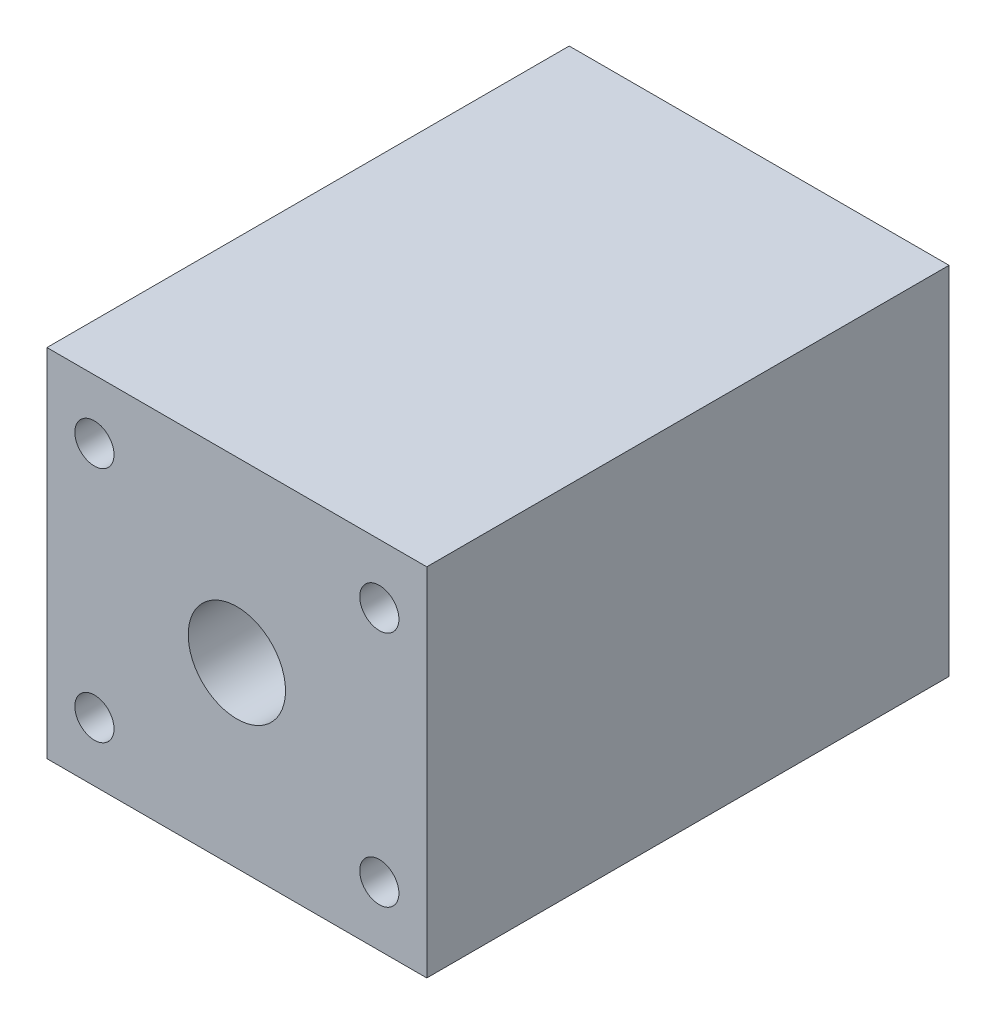
ISO-10303-21;
HEADER;
FILE_DESCRIPTION(('STEP AP214'),'2;1');
FILE_NAME('part.step','',(''),(''),'','','');
FILE_SCHEMA(('AUTOMOTIVE_DESIGN { 1 0 10303 214 1 1 1 1 }'));
ENDSEC;
DATA;
#1=APPLICATION_CONTEXT('core data for automotive mechanical design processes');
#2=APPLICATION_PROTOCOL_DEFINITION('international standard','automotive_design',2000,#1);
#3=PRODUCT_CONTEXT('',#1,'mechanical');
#4=PRODUCT('Part','Part','',(#3));
#5=PRODUCT_RELATED_PRODUCT_CATEGORY('part','',(#4));
#6=PRODUCT_DEFINITION_FORMATION('','',#4);
#7=PRODUCT_DEFINITION_CONTEXT('part definition',#1,'design');
#8=PRODUCT_DEFINITION('design','',#6,#7);
#9=PRODUCT_DEFINITION_SHAPE('','',#8);
#10=(LENGTH_UNIT() NAMED_UNIT(*) SI_UNIT(.MILLI.,.METRE.));
#11=(NAMED_UNIT(*) PLANE_ANGLE_UNIT() SI_UNIT($,.RADIAN.));
#12=(NAMED_UNIT(*) SI_UNIT($,.STERADIAN.) SOLID_ANGLE_UNIT());
#13=UNCERTAINTY_MEASURE_WITH_UNIT(LENGTH_MEASURE(1.E-05),#10,'distance_accuracy_value','');
#14=(GEOMETRIC_REPRESENTATION_CONTEXT(3) GLOBAL_UNCERTAINTY_ASSIGNED_CONTEXT((#13)) GLOBAL_UNIT_ASSIGNED_CONTEXT((#10,
#11,#12)) REPRESENTATION_CONTEXT('',''));
#15=CARTESIAN_POINT('',(0.,0.,0.));
#16=DIRECTION('',(0.,0.,1.));
#17=DIRECTION('',(1.,0.,0.));
#18=AXIS2_PLACEMENT_3D('',#15,#16,#17);
#19=CARTESIAN_POINT('',(12.,10.,36.));
#20=DIRECTION('',(0.,0.,1.));
#21=DIRECTION('',(1.,0.,0.));
#22=AXIS2_PLACEMENT_3D('',#19,#20,#21);
#23=PLANE('',#22);
#24=CARTESIAN_POINT('',(12.,10.,36.));
#25=DIRECTION('',(0.,0.,1.));
#26=DIRECTION('',(1.,0.,0.));
#27=AXIS2_PLACEMENT_3D('',#24,#25,#26);
#28=CIRCLE('',#27,1.65);
#29=CARTESIAN_POINT('',(13.65,10.,36.));
#30=VERTEX_POINT('',#29);
#31=EDGE_CURVE('E10',#30,#30,#28,.T.);
#32=ORIENTED_EDGE('',*,*,#31,.T.);
#33=EDGE_LOOP('',(#32));
#34=FACE_BOUND('',#33,.T.);
#35=ADVANCED_FACE('F16',(#34),#23,.T.);
#36=CARTESIAN_POINT('',(-12.,10.,36.));
#37=DIRECTION('',(0.,0.,1.));
#38=DIRECTION('',(1.,0.,0.));
#39=AXIS2_PLACEMENT_3D('',#36,#37,#38);
#40=PLANE('',#39);
#41=CARTESIAN_POINT('',(-12.,10.,36.));
#42=DIRECTION('',(0.,0.,1.));
#43=DIRECTION('',(1.,0.,0.));
#44=AXIS2_PLACEMENT_3D('',#41,#42,#43);
#45=CIRCLE('',#44,1.65);
#46=CARTESIAN_POINT('',(-10.35,10.,36.));
#47=VERTEX_POINT('',#46);
#48=EDGE_CURVE('E26',#47,#47,#45,.T.);
#49=ORIENTED_EDGE('',*,*,#48,.T.);
#50=EDGE_LOOP('',(#49));
#51=FACE_BOUND('',#50,.T.);
#52=ADVANCED_FACE('F18',(#51),#40,.T.);
#53=CARTESIAN_POINT('',(12.,-10.,36.));
#54=DIRECTION('',(0.,0.,1.));
#55=DIRECTION('',(1.,0.,0.));
#56=AXIS2_PLACEMENT_3D('',#53,#54,#55);
#57=PLANE('',#56);
#58=CARTESIAN_POINT('',(12.,-10.,36.));
#59=DIRECTION('',(0.,0.,1.));
#60=DIRECTION('',(1.,0.,0.));
#61=AXIS2_PLACEMENT_3D('',#58,#59,#60);
#62=CIRCLE('',#61,1.65);
#63=CARTESIAN_POINT('',(13.65,-10.,36.));
#64=VERTEX_POINT('',#63);
#65=EDGE_CURVE('E121',#64,#64,#62,.T.);
#66=ORIENTED_EDGE('',*,*,#65,.T.);
#67=EDGE_LOOP('',(#66));
#68=FACE_BOUND('',#67,.T.);
#69=ADVANCED_FACE('F155',(#68),#57,.T.);
#70=CARTESIAN_POINT('',(-12.,-10.,36.));
#71=DIRECTION('',(0.,0.,1.));
#72=DIRECTION('',(1.,0.,0.));
#73=AXIS2_PLACEMENT_3D('',#70,#71,#72);
#74=PLANE('',#73);
#75=CARTESIAN_POINT('',(-12.,-10.,36.));
#76=DIRECTION('',(0.,0.,1.));
#77=DIRECTION('',(1.,0.,0.));
#78=AXIS2_PLACEMENT_3D('',#75,#76,#77);
#79=CIRCLE('',#78,1.65);
#80=CARTESIAN_POINT('',(-10.35,-10.,36.));
#81=VERTEX_POINT('',#80);
#82=EDGE_CURVE('E117',#81,#81,#79,.T.);
#83=ORIENTED_EDGE('',*,*,#82,.T.);
#84=EDGE_LOOP('',(#83));
#85=FACE_BOUND('',#84,.T.);
#86=ADVANCED_FACE('F176',(#85),#74,.T.);
#87=CARTESIAN_POINT('',(12.,10.,36.));
#88=DIRECTION('',(0.,0.,1.));
#89=DIRECTION('',(1.,0.,0.));
#90=AXIS2_PLACEMENT_3D('',#87,#88,#89);
#91=CYLINDRICAL_SURFACE('',#90,1.65);
#92=CARTESIAN_POINT('',(12.,10.,44.));
#93=DIRECTION('',(0.,0.,1.));
#94=DIRECTION('',(1.,0.,0.));
#95=AXIS2_PLACEMENT_3D('',#92,#93,#94);
#96=CIRCLE('',#95,1.65);
#97=CARTESIAN_POINT('',(13.65,10.,44.));
#98=VERTEX_POINT('',#97);
#99=EDGE_CURVE('E104',#98,#98,#96,.T.);
#100=ORIENTED_EDGE('',*,*,#99,.T.);
#101=EDGE_LOOP('',(#100));
#102=FACE_BOUND('',#101,.T.);
#103=ORIENTED_EDGE('',*,*,#31,.F.);
#104=EDGE_LOOP('',(#103));
#105=FACE_BOUND('',#104,.T.);
#106=ADVANCED_FACE('F144',(#102,#105),#91,.F.);
#107=CARTESIAN_POINT('',(0.,0.,-1.));
#108=DIRECTION('',(0.,0.,1.));
#109=DIRECTION('',(1.,0.,0.));
#110=AXIS2_PLACEMENT_3D('',#107,#108,#109);
#111=CYLINDRICAL_SURFACE('',#110,4.1);
#112=CARTESIAN_POINT('',(0.,0.,44.));
#113=DIRECTION('',(0.,0.,1.));
#114=DIRECTION('',(1.,0.,0.));
#115=AXIS2_PLACEMENT_3D('',#112,#113,#114);
#116=CIRCLE('',#115,4.1);
#117=CARTESIAN_POINT('',(4.1,0.,44.));
#118=VERTEX_POINT('',#117);
#119=EDGE_CURVE('E100',#118,#118,#116,.T.);
#120=ORIENTED_EDGE('',*,*,#119,.T.);
#121=EDGE_LOOP('',(#120));
#122=FACE_BOUND('',#121,.T.);
#123=CARTESIAN_POINT('',(0.,0.,0.));
#124=DIRECTION('',(0.,0.,1.));
#125=DIRECTION('',(1.,0.,0.));
#126=AXIS2_PLACEMENT_3D('',#123,#124,#125);
#127=CIRCLE('',#126,4.1);
#128=CARTESIAN_POINT('',(4.1,0.,0.));
#129=VERTEX_POINT('',#128);
#130=EDGE_CURVE('E113',#129,#129,#127,.T.);
#131=ORIENTED_EDGE('',*,*,#130,.F.);
#132=EDGE_LOOP('',(#131));
#133=FACE_BOUND('',#132,.T.);
#134=ADVANCED_FACE('F133',(#122,#133),#111,.F.);
#135=CARTESIAN_POINT('',(-12.,10.,36.));
#136=DIRECTION('',(0.,0.,1.));
#137=DIRECTION('',(1.,0.,0.));
#138=AXIS2_PLACEMENT_3D('',#135,#136,#137);
#139=CYLINDRICAL_SURFACE('',#138,1.65);
#140=CARTESIAN_POINT('',(-12.,10.,44.));
#141=DIRECTION('',(0.,0.,1.));
#142=DIRECTION('',(1.,0.,0.));
#143=AXIS2_PLACEMENT_3D('',#140,#141,#142);
#144=CIRCLE('',#143,1.65);
#145=CARTESIAN_POINT('',(-10.35,10.,44.));
#146=VERTEX_POINT('',#145);
#147=EDGE_CURVE('E93',#146,#146,#144,.T.);
#148=ORIENTED_EDGE('',*,*,#147,.T.);
#149=EDGE_LOOP('',(#148));
#150=FACE_BOUND('',#149,.T.);
#151=ORIENTED_EDGE('',*,*,#48,.F.);
#152=EDGE_LOOP('',(#151));
#153=FACE_BOUND('',#152,.T.);
#154=ADVANCED_FACE('F130',(#150,#153),#139,.F.);
#155=CARTESIAN_POINT('',(12.,-10.,36.));
#156=DIRECTION('',(0.,0.,1.));
#157=DIRECTION('',(1.,0.,0.));
#158=AXIS2_PLACEMENT_3D('',#155,#156,#157);
#159=CYLINDRICAL_SURFACE('',#158,1.65);
#160=CARTESIAN_POINT('',(12.,-10.,44.));
#161=DIRECTION('',(0.,0.,1.));
#162=DIRECTION('',(1.,0.,0.));
#163=AXIS2_PLACEMENT_3D('',#160,#161,#162);
#164=CIRCLE('',#163,1.65);
#165=CARTESIAN_POINT('',(13.65,-10.,44.));
#166=VERTEX_POINT('',#165);
#167=EDGE_CURVE('E89',#166,#166,#164,.T.);
#168=ORIENTED_EDGE('',*,*,#167,.T.);
#169=EDGE_LOOP('',(#168));
#170=FACE_BOUND('',#169,.T.);
#171=ORIENTED_EDGE('',*,*,#65,.F.);
#172=EDGE_LOOP('',(#171));
#173=FACE_BOUND('',#172,.T.);
#174=ADVANCED_FACE('F132',(#170,#173),#159,.F.);
#175=CARTESIAN_POINT('',(-12.,-10.,36.));
#176=DIRECTION('',(0.,0.,1.));
#177=DIRECTION('',(1.,0.,0.));
#178=AXIS2_PLACEMENT_3D('',#175,#176,#177);
#179=CYLINDRICAL_SURFACE('',#178,1.65);
#180=CARTESIAN_POINT('',(-12.,-10.,44.));
#181=DIRECTION('',(0.,0.,1.));
#182=DIRECTION('',(1.,0.,0.));
#183=AXIS2_PLACEMENT_3D('',#180,#181,#182);
#184=CIRCLE('',#183,1.65);
#185=CARTESIAN_POINT('',(-10.35,-10.,44.));
#186=VERTEX_POINT('',#185);
#187=EDGE_CURVE('E94',#186,#186,#184,.T.);
#188=ORIENTED_EDGE('',*,*,#187,.T.);
#189=EDGE_LOOP('',(#188));
#190=FACE_BOUND('',#189,.T.);
#191=ORIENTED_EDGE('',*,*,#82,.F.);
#192=EDGE_LOOP('',(#191));
#193=FACE_BOUND('',#192,.T.);
#194=ADVANCED_FACE('F141',(#190,#193),#179,.F.);
#195=CARTESIAN_POINT('',(16.,-15.,0.));
#196=DIRECTION('',(1.,0.,0.));
#197=DIRECTION('',(0.,1.,0.));
#198=AXIS2_PLACEMENT_3D('',#195,#196,#197);
#199=PLANE('',#198);
#200=DIRECTION('',(0.,0.,1.));
#201=VECTOR('',#200,1.);
#202=CARTESIAN_POINT('',(16.,-15.,0.));
#203=LINE('',#202,#201);
#204=CARTESIAN_POINT('',(16.,-15.,0.));
#205=VERTEX_POINT('',#204);
#206=CARTESIAN_POINT('',(16.,-15.,44.));
#207=VERTEX_POINT('',#206);
#208=EDGE_CURVE('E55',#205,#207,#203,.T.);
#209=ORIENTED_EDGE('',*,*,#208,.F.);
#210=DIRECTION('',(0.,1.,0.));
#211=VECTOR('',#210,1.);
#212=CARTESIAN_POINT('',(16.,-15.,0.));
#213=LINE('',#212,#211);
#214=CARTESIAN_POINT('',(16.,15.,0.));
#215=VERTEX_POINT('',#214);
#216=EDGE_CURVE('E38',#205,#215,#213,.T.);
#217=ORIENTED_EDGE('',*,*,#216,.T.);
#218=DIRECTION('',(0.,0.,1.));
#219=VECTOR('',#218,1.);
#220=CARTESIAN_POINT('',(16.,15.,0.));
#221=LINE('',#220,#219);
#222=CARTESIAN_POINT('',(16.,15.,44.));
#223=VERTEX_POINT('',#222);
#224=EDGE_CURVE('E56',#215,#223,#221,.T.);
#225=ORIENTED_EDGE('',*,*,#224,.T.);
#226=DIRECTION('',(0.,1.,0.));
#227=VECTOR('',#226,1.);
#228=CARTESIAN_POINT('',(16.,-15.,44.));
#229=LINE('',#228,#227);
#230=EDGE_CURVE('E51',#207,#223,#229,.T.);
#231=ORIENTED_EDGE('',*,*,#230,.F.);
#232=EDGE_LOOP('',(#209,#217,#225,#231));
#233=FACE_BOUND('',#232,.T.);
#234=ADVANCED_FACE('F53',(#233),#199,.T.);
#235=CARTESIAN_POINT('',(-16.,-15.,0.));
#236=DIRECTION('',(0.,0.,1.));
#237=DIRECTION('',(1.,0.,0.));
#238=AXIS2_PLACEMENT_3D('',#235,#236,#237);
#239=PLANE('',#238);
#240=ORIENTED_EDGE('',*,*,#130,.T.);
#241=EDGE_LOOP('',(#240));
#242=FACE_BOUND('',#241,.T.);
#243=DIRECTION('',(1.,0.,0.));
#244=VECTOR('',#243,1.);
#245=CARTESIAN_POINT('',(-16.,15.,0.));
#246=LINE('',#245,#244);
#247=CARTESIAN_POINT('',(-16.,15.,0.));
#248=VERTEX_POINT('',#247);
#249=EDGE_CURVE('E108',#248,#215,#246,.T.);
#250=ORIENTED_EDGE('',*,*,#249,.T.);
#251=ORIENTED_EDGE('',*,*,#216,.F.);
#252=DIRECTION('',(1.,0.,0.));
#253=VECTOR('',#252,1.);
#254=CARTESIAN_POINT('',(-16.,-15.,0.));
#255=LINE('',#254,#253);
#256=CARTESIAN_POINT('',(-16.,-15.,0.));
#257=VERTEX_POINT('',#256);
#258=EDGE_CURVE('E62',#257,#205,#255,.T.);
#259=ORIENTED_EDGE('',*,*,#258,.F.);
#260=DIRECTION('',(0.,1.,0.));
#261=VECTOR('',#260,1.);
#262=CARTESIAN_POINT('',(-16.,-15.,0.));
#263=LINE('',#262,#261);
#264=EDGE_CURVE('E84',#257,#248,#263,.T.);
#265=ORIENTED_EDGE('',*,*,#264,.T.);
#266=EDGE_LOOP('',(#250,#251,#259,#265));
#267=FACE_BOUND('',#266,.T.);
#268=ADVANCED_FACE('F169',(#242,#267),#239,.F.);
#269=CARTESIAN_POINT('',(-16.,15.,0.));
#270=DIRECTION('',(0.,1.,0.));
#271=DIRECTION('',(1.,0.,0.));
#272=AXIS2_PLACEMENT_3D('',#269,#270,#271);
#273=PLANE('',#272);
#274=ORIENTED_EDGE('',*,*,#249,.F.);
#275=DIRECTION('',(0.,0.,1.));
#276=VECTOR('',#275,1.);
#277=CARTESIAN_POINT('',(-16.,15.,0.));
#278=LINE('',#277,#276);
#279=CARTESIAN_POINT('',(-16.,15.,44.));
#280=VERTEX_POINT('',#279);
#281=EDGE_CURVE('E205',#248,#280,#278,.T.);
#282=ORIENTED_EDGE('',*,*,#281,.T.);
#283=DIRECTION('',(1.,0.,0.));
#284=VECTOR('',#283,1.);
#285=CARTESIAN_POINT('',(-16.,15.,44.));
#286=LINE('',#285,#284);
#287=EDGE_CURVE('E61',#280,#223,#286,.T.);
#288=ORIENTED_EDGE('',*,*,#287,.T.);
#289=ORIENTED_EDGE('',*,*,#224,.F.);
#290=EDGE_LOOP('',(#274,#282,#288,#289));
#291=FACE_BOUND('',#290,.T.);
#292=ADVANCED_FACE('F165',(#291),#273,.T.);
#293=CARTESIAN_POINT('',(-16.,-15.,44.));
#294=DIRECTION('',(0.,0.,1.));
#295=DIRECTION('',(1.,0.,0.));
#296=AXIS2_PLACEMENT_3D('',#293,#294,#295);
#297=PLANE('',#296);
#298=ORIENTED_EDGE('',*,*,#99,.F.);
#299=EDGE_LOOP('',(#298));
#300=FACE_BOUND('',#299,.T.);
#301=ORIENTED_EDGE('',*,*,#119,.F.);
#302=EDGE_LOOP('',(#301));
#303=FACE_BOUND('',#302,.T.);
#304=ORIENTED_EDGE('',*,*,#147,.F.);
#305=EDGE_LOOP('',(#304));
#306=FACE_BOUND('',#305,.T.);
#307=ORIENTED_EDGE('',*,*,#167,.F.);
#308=EDGE_LOOP('',(#307));
#309=FACE_BOUND('',#308,.T.);
#310=ORIENTED_EDGE('',*,*,#187,.F.);
#311=EDGE_LOOP('',(#310));
#312=FACE_BOUND('',#311,.T.);
#313=DIRECTION('',(0.,1.,0.));
#314=VECTOR('',#313,1.);
#315=CARTESIAN_POINT('',(-16.,-15.,44.));
#316=LINE('',#315,#314);
#317=CARTESIAN_POINT('',(-16.,-15.,44.));
#318=VERTEX_POINT('',#317);
#319=EDGE_CURVE('E70',#318,#280,#316,.T.);
#320=ORIENTED_EDGE('',*,*,#319,.F.);
#321=DIRECTION('',(1.,0.,0.));
#322=VECTOR('',#321,1.);
#323=CARTESIAN_POINT('',(-16.,-15.,44.));
#324=LINE('',#323,#322);
#325=EDGE_CURVE('E66',#318,#207,#324,.T.);
#326=ORIENTED_EDGE('',*,*,#325,.T.);
#327=ORIENTED_EDGE('',*,*,#230,.T.);
#328=ORIENTED_EDGE('',*,*,#287,.F.);
#329=EDGE_LOOP('',(#320,#326,#327,#328));
#330=FACE_BOUND('',#329,.T.);
#331=ADVANCED_FACE('F67',(#300,#303,#306,#309,#312,#330),#297,.T.);
#332=CARTESIAN_POINT('',(-16.,-15.,0.));
#333=DIRECTION('',(0.,1.,0.));
#334=DIRECTION('',(1.,0.,0.));
#335=AXIS2_PLACEMENT_3D('',#332,#333,#334);
#336=PLANE('',#335);
#337=ORIENTED_EDGE('',*,*,#208,.T.);
#338=ORIENTED_EDGE('',*,*,#325,.F.);
#339=DIRECTION('',(0.,0.,1.));
#340=VECTOR('',#339,1.);
#341=CARTESIAN_POINT('',(-16.,-15.,0.));
#342=LINE('',#341,#340);
#343=EDGE_CURVE('E80',#257,#318,#342,.T.);
#344=ORIENTED_EDGE('',*,*,#343,.F.);
#345=ORIENTED_EDGE('',*,*,#258,.T.);
#346=EDGE_LOOP('',(#337,#338,#344,#345));
#347=FACE_BOUND('',#346,.T.);
#348=ADVANCED_FACE('F77',(#347),#336,.F.);
#349=CARTESIAN_POINT('',(-16.,-15.,0.));
#350=DIRECTION('',(1.,0.,0.));
#351=DIRECTION('',(0.,1.,0.));
#352=AXIS2_PLACEMENT_3D('',#349,#350,#351);
#353=PLANE('',#352);
#354=ORIENTED_EDGE('',*,*,#319,.T.);
#355=ORIENTED_EDGE('',*,*,#281,.F.);
#356=ORIENTED_EDGE('',*,*,#264,.F.);
#357=ORIENTED_EDGE('',*,*,#343,.T.);
#358=EDGE_LOOP('',(#354,#355,#356,#357));
#359=FACE_BOUND('',#358,.T.);
#360=ADVANCED_FACE('F157',(#359),#353,.F.);
#361=CLOSED_SHELL('',(#35,#52,#69,#86,#106,#134,#154,#174,#194,#234,#268,#292,#331,#348,#360));
#362=MANIFOLD_SOLID_BREP('B1',#361);
#363=ADVANCED_BREP_SHAPE_REPRESENTATION('',(#18,#362),#14);
#364=SHAPE_DEFINITION_REPRESENTATION(#9,#363);
ENDSEC;
END-ISO-10303-21;
